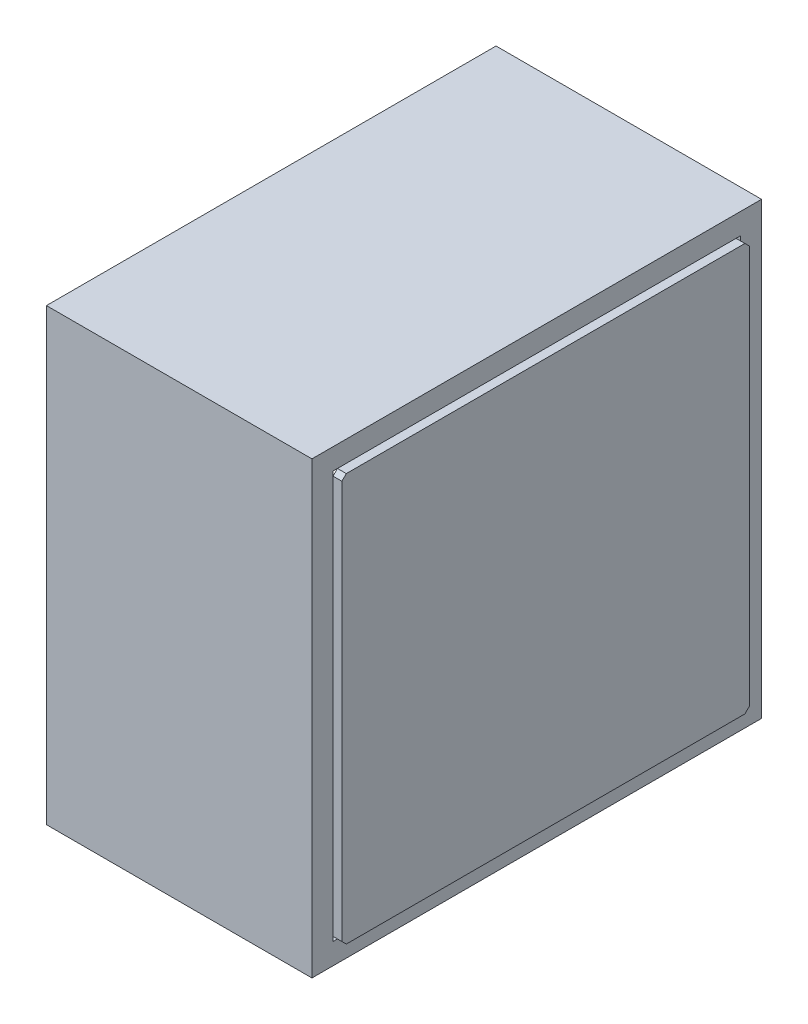
ISO-10303-21;
HEADER;
FILE_DESCRIPTION(('STEP AP214'),'2;1');
FILE_NAME('part.step','',(''),(''),'','','');
FILE_SCHEMA(('AUTOMOTIVE_DESIGN { 1 0 10303 214 1 1 1 1 }'));
ENDSEC;
DATA;
#1=APPLICATION_CONTEXT('core data for automotive mechanical design processes');
#2=APPLICATION_PROTOCOL_DEFINITION('international standard','automotive_design',2000,#1);
#3=PRODUCT_CONTEXT('',#1,'mechanical');
#4=PRODUCT('Part','Part','',(#3));
#5=PRODUCT_RELATED_PRODUCT_CATEGORY('part','',(#4));
#6=PRODUCT_DEFINITION_FORMATION('','',#4);
#7=PRODUCT_DEFINITION_CONTEXT('part definition',#1,'design');
#8=PRODUCT_DEFINITION('design','',#6,#7);
#9=PRODUCT_DEFINITION_SHAPE('','',#8);
#10=(LENGTH_UNIT() NAMED_UNIT(*) SI_UNIT(.MILLI.,.METRE.));
#11=(NAMED_UNIT(*) PLANE_ANGLE_UNIT() SI_UNIT($,.RADIAN.));
#12=(NAMED_UNIT(*) SI_UNIT($,.STERADIAN.) SOLID_ANGLE_UNIT());
#13=UNCERTAINTY_MEASURE_WITH_UNIT(LENGTH_MEASURE(1.E-05),#10,'distance_accuracy_value','');
#14=(GEOMETRIC_REPRESENTATION_CONTEXT(3) GLOBAL_UNCERTAINTY_ASSIGNED_CONTEXT((#13)) GLOBAL_UNIT_ASSIGNED_CONTEXT((#10,
#11,#12)) REPRESENTATION_CONTEXT('',''));
#15=CARTESIAN_POINT('',(0.,0.,0.));
#16=DIRECTION('',(0.,0.,1.));
#17=DIRECTION('',(1.,0.,0.));
#18=AXIS2_PLACEMENT_3D('',#15,#16,#17);
#19=CARTESIAN_POINT('',(62.,45.0375,-46.0375));
#20=DIRECTION('',(0.,-0.707106781186547,0.707106781186547));
#21=DIRECTION('',(0.,-0.707106781186548,-0.707106781186548));
#22=AXIS2_PLACEMENT_3D('',#19,#20,#21);
#23=PLANE('',#22);
#24=DIRECTION('',(0.,0.707106781186547,0.707106781186547));
#25=VECTOR('',#24,1.);
#26=CARTESIAN_POINT('',(60.,45.0375,-46.0375));
#27=LINE('',#26,#25);
#28=CARTESIAN_POINT('',(60.,45.0375,-46.0375));
#29=VERTEX_POINT('',#28);
#30=CARTESIAN_POINT('',(60.,46.0375,-45.0375));
#31=VERTEX_POINT('',#30);
#32=EDGE_CURVE('E164',#29,#31,#27,.T.);
#33=ORIENTED_EDGE('',*,*,#32,.T.);
#34=DIRECTION('',(-1.,0.,0.));
#35=VECTOR('',#34,1.);
#36=CARTESIAN_POINT('',(62.,46.0375,-45.0375));
#37=LINE('',#36,#35);
#38=CARTESIAN_POINT('',(62.,46.0375,-45.0375));
#39=VERTEX_POINT('',#38);
#40=EDGE_CURVE('E13',#39,#31,#37,.T.);
#41=ORIENTED_EDGE('',*,*,#40,.F.);
#42=DIRECTION('',(0.,0.707106781186547,0.707106781186547));
#43=VECTOR('',#42,1.);
#44=CARTESIAN_POINT('',(62.,45.0375,-46.0375));
#45=LINE('',#44,#43);
#46=CARTESIAN_POINT('',(62.,45.0375,-46.0375));
#47=VERTEX_POINT('',#46);
#48=EDGE_CURVE('E178',#47,#39,#45,.T.);
#49=ORIENTED_EDGE('',*,*,#48,.F.);
#50=DIRECTION('',(-1.,0.,0.));
#51=VECTOR('',#50,1.);
#52=CARTESIAN_POINT('',(62.,45.0375,-46.0375));
#53=LINE('',#52,#51);
#54=EDGE_CURVE('E161',#47,#29,#53,.T.);
#55=ORIENTED_EDGE('',*,*,#54,.T.);
#56=EDGE_LOOP('',(#33,#41,#49,#55));
#57=FACE_BOUND('',#56,.T.);
#58=ADVANCED_FACE('F68',(#57),#23,.F.);
#59=CARTESIAN_POINT('',(62.,46.0375,-45.0375));
#60=DIRECTION('',(0.,-1.,0.));
#61=DIRECTION('',(0.,0.,-1.));
#62=AXIS2_PLACEMENT_3D('',#59,#60,#61);
#63=PLANE('',#62);
#64=DIRECTION('',(0.,0.,1.));
#65=VECTOR('',#64,1.);
#66=CARTESIAN_POINT('',(60.,46.0375,-45.0375));
#67=LINE('',#66,#65);
#68=CARTESIAN_POINT('',(60.,46.0375,45.0375));
#69=VERTEX_POINT('',#68);
#70=EDGE_CURVE('E169',#31,#69,#67,.T.);
#71=ORIENTED_EDGE('',*,*,#70,.T.);
#72=DIRECTION('',(-1.,0.,0.));
#73=VECTOR('',#72,1.);
#74=CARTESIAN_POINT('',(62.,46.0375,45.0375));
#75=LINE('',#74,#73);
#76=CARTESIAN_POINT('',(62.,46.0375,45.0375));
#77=VERTEX_POINT('',#76);
#78=EDGE_CURVE('E77',#77,#69,#75,.T.);
#79=ORIENTED_EDGE('',*,*,#78,.F.);
#80=DIRECTION('',(0.,0.,1.));
#81=VECTOR('',#80,1.);
#82=CARTESIAN_POINT('',(62.,46.0375,-45.0375));
#83=LINE('',#82,#81);
#84=EDGE_CURVE('E126',#39,#77,#83,.T.);
#85=ORIENTED_EDGE('',*,*,#84,.F.);
#86=ORIENTED_EDGE('',*,*,#40,.T.);
#87=EDGE_LOOP('',(#71,#79,#85,#86));
#88=FACE_BOUND('',#87,.T.);
#89=ADVANCED_FACE('F212',(#88),#63,.F.);
#90=CARTESIAN_POINT('',(62.,46.0375,45.0375));
#91=DIRECTION('',(0.,-0.707106781186547,-0.707106781186547));
#92=DIRECTION('',(0.,0.707106781186548,-0.707106781186548));
#93=AXIS2_PLACEMENT_3D('',#90,#91,#92);
#94=PLANE('',#93);
#95=DIRECTION('',(0.,-0.707106781186547,0.707106781186547));
#96=VECTOR('',#95,1.);
#97=CARTESIAN_POINT('',(60.,46.0375,45.0375));
#98=LINE('',#97,#96);
#99=CARTESIAN_POINT('',(60.,45.0375,46.0375));
#100=VERTEX_POINT('',#99);
#101=EDGE_CURVE('E168',#69,#100,#98,.T.);
#102=ORIENTED_EDGE('',*,*,#101,.T.);
#103=DIRECTION('',(-1.,0.,0.));
#104=VECTOR('',#103,1.);
#105=CARTESIAN_POINT('',(62.,45.0375,46.0375));
#106=LINE('',#105,#104);
#107=CARTESIAN_POINT('',(62.,45.0375,46.0375));
#108=VERTEX_POINT('',#107);
#109=EDGE_CURVE('E186',#108,#100,#106,.T.);
#110=ORIENTED_EDGE('',*,*,#109,.F.);
#111=DIRECTION('',(0.,-0.707106781186547,0.707106781186547));
#112=VECTOR('',#111,1.);
#113=CARTESIAN_POINT('',(62.,46.0375,45.0375));
#114=LINE('',#113,#112);
#115=EDGE_CURVE('E193',#77,#108,#114,.T.);
#116=ORIENTED_EDGE('',*,*,#115,.F.);
#117=ORIENTED_EDGE('',*,*,#78,.T.);
#118=EDGE_LOOP('',(#102,#110,#116,#117));
#119=FACE_BOUND('',#118,.T.);
#120=ADVANCED_FACE('F191',(#119),#94,.F.);
#121=CARTESIAN_POINT('',(62.,45.0375,46.0375));
#122=DIRECTION('',(0.,0.,-1.));
#123=DIRECTION('',(-1.,0.,0.));
#124=AXIS2_PLACEMENT_3D('',#121,#122,#123);
#125=PLANE('',#124);
#126=DIRECTION('',(0.,-1.,0.));
#127=VECTOR('',#126,1.);
#128=CARTESIAN_POINT('',(60.,45.0375,46.0375));
#129=LINE('',#128,#127);
#130=CARTESIAN_POINT('',(60.,-45.0375,46.0375));
#131=VERTEX_POINT('',#130);
#132=EDGE_CURVE('E172',#100,#131,#129,.T.);
#133=ORIENTED_EDGE('',*,*,#132,.T.);
#134=DIRECTION('',(-1.,0.,0.));
#135=VECTOR('',#134,1.);
#136=CARTESIAN_POINT('',(62.,-45.0375,46.0375));
#137=LINE('',#136,#135);
#138=CARTESIAN_POINT('',(62.,-45.0375,46.0375));
#139=VERTEX_POINT('',#138);
#140=EDGE_CURVE('E181',#139,#131,#137,.T.);
#141=ORIENTED_EDGE('',*,*,#140,.F.);
#142=DIRECTION('',(0.,-1.,0.));
#143=VECTOR('',#142,1.);
#144=CARTESIAN_POINT('',(62.,45.0375,46.0375));
#145=LINE('',#144,#143);
#146=EDGE_CURVE('E206',#108,#139,#145,.T.);
#147=ORIENTED_EDGE('',*,*,#146,.F.);
#148=ORIENTED_EDGE('',*,*,#109,.T.);
#149=EDGE_LOOP('',(#133,#141,#147,#148));
#150=FACE_BOUND('',#149,.T.);
#151=ADVANCED_FACE('F205',(#150),#125,.F.);
#152=CARTESIAN_POINT('',(62.,-45.0375,46.0375));
#153=DIRECTION('',(0.,0.707106781186547,-0.707106781186547));
#154=DIRECTION('',(0.,0.707106781186548,0.707106781186548));
#155=AXIS2_PLACEMENT_3D('',#152,#153,#154);
#156=PLANE('',#155);
#157=DIRECTION('',(0.,-0.707106781186547,-0.707106781186547));
#158=VECTOR('',#157,1.);
#159=CARTESIAN_POINT('',(60.,-45.0375,46.0375));
#160=LINE('',#159,#158);
#161=CARTESIAN_POINT('',(60.,-46.0375,45.0375));
#162=VERTEX_POINT('',#161);
#163=EDGE_CURVE('E173',#131,#162,#160,.T.);
#164=ORIENTED_EDGE('',*,*,#163,.T.);
#165=DIRECTION('',(-1.,0.,0.));
#166=VECTOR('',#165,1.);
#167=CARTESIAN_POINT('',(62.,-46.0375,45.0375));
#168=LINE('',#167,#166);
#169=CARTESIAN_POINT('',(62.,-46.0375,45.0375));
#170=VERTEX_POINT('',#169);
#171=EDGE_CURVE('E156',#170,#162,#168,.T.);
#172=ORIENTED_EDGE('',*,*,#171,.F.);
#173=DIRECTION('',(0.,-0.707106781186547,-0.707106781186547));
#174=VECTOR('',#173,1.);
#175=CARTESIAN_POINT('',(62.,-45.0375,46.0375));
#176=LINE('',#175,#174);
#177=EDGE_CURVE('E150',#139,#170,#176,.T.);
#178=ORIENTED_EDGE('',*,*,#177,.F.);
#179=ORIENTED_EDGE('',*,*,#140,.T.);
#180=EDGE_LOOP('',(#164,#172,#178,#179));
#181=FACE_BOUND('',#180,.T.);
#182=ADVANCED_FACE('F202',(#181),#156,.F.);
#183=CARTESIAN_POINT('',(62.,-46.0375,45.0375));
#184=DIRECTION('',(0.,1.,0.));
#185=DIRECTION('',(0.,0.,1.));
#186=AXIS2_PLACEMENT_3D('',#183,#184,#185);
#187=PLANE('',#186);
#188=DIRECTION('',(0.,0.,-1.));
#189=VECTOR('',#188,1.);
#190=CARTESIAN_POINT('',(60.,-46.0375,45.0375));
#191=LINE('',#190,#189);
#192=CARTESIAN_POINT('',(60.,-46.0375,-45.0375));
#193=VERTEX_POINT('',#192);
#194=EDGE_CURVE('E154',#162,#193,#191,.T.);
#195=ORIENTED_EDGE('',*,*,#194,.T.);
#196=DIRECTION('',(-1.,0.,0.));
#197=VECTOR('',#196,1.);
#198=CARTESIAN_POINT('',(62.,-46.0375,-45.0375));
#199=LINE('',#198,#197);
#200=CARTESIAN_POINT('',(62.,-46.0375,-45.0375));
#201=VERTEX_POINT('',#200);
#202=EDGE_CURVE('E155',#201,#193,#199,.T.);
#203=ORIENTED_EDGE('',*,*,#202,.F.);
#204=DIRECTION('',(0.,0.,-1.));
#205=VECTOR('',#204,1.);
#206=CARTESIAN_POINT('',(62.,-46.0375,45.0375));
#207=LINE('',#206,#205);
#208=EDGE_CURVE('E143',#170,#201,#207,.T.);
#209=ORIENTED_EDGE('',*,*,#208,.F.);
#210=ORIENTED_EDGE('',*,*,#171,.T.);
#211=EDGE_LOOP('',(#195,#203,#209,#210));
#212=FACE_BOUND('',#211,.T.);
#213=ADVANCED_FACE('F153',(#212),#187,.F.);
#214=CARTESIAN_POINT('',(62.,-46.0375,-45.0375));
#215=DIRECTION('',(0.,0.707106781186547,0.707106781186547));
#216=DIRECTION('',(0.,-0.707106781186548,0.707106781186548));
#217=AXIS2_PLACEMENT_3D('',#214,#215,#216);
#218=PLANE('',#217);
#219=DIRECTION('',(0.,0.707106781186547,-0.707106781186547));
#220=VECTOR('',#219,1.);
#221=CARTESIAN_POINT('',(60.,-46.0375,-45.0375));
#222=LINE('',#221,#220);
#223=CARTESIAN_POINT('',(60.,-45.0375,-46.0375));
#224=VERTEX_POINT('',#223);
#225=EDGE_CURVE('E111',#193,#224,#222,.T.);
#226=ORIENTED_EDGE('',*,*,#225,.T.);
#227=DIRECTION('',(-1.,0.,0.));
#228=VECTOR('',#227,1.);
#229=CARTESIAN_POINT('',(62.,-45.0375,-46.0375));
#230=LINE('',#229,#228);
#231=CARTESIAN_POINT('',(62.,-45.0375,-46.0375));
#232=VERTEX_POINT('',#231);
#233=EDGE_CURVE('E160',#232,#224,#230,.T.);
#234=ORIENTED_EDGE('',*,*,#233,.F.);
#235=DIRECTION('',(0.,0.707106781186547,-0.707106781186547));
#236=VECTOR('',#235,1.);
#237=CARTESIAN_POINT('',(62.,-46.0375,-45.0375));
#238=LINE('',#237,#236);
#239=EDGE_CURVE('E144',#201,#232,#238,.T.);
#240=ORIENTED_EDGE('',*,*,#239,.F.);
#241=ORIENTED_EDGE('',*,*,#202,.T.);
#242=EDGE_LOOP('',(#226,#234,#240,#241));
#243=FACE_BOUND('',#242,.T.);
#244=ADVANCED_FACE('F157',(#243),#218,.F.);
#245=CARTESIAN_POINT('',(62.,-45.0375,-46.0375));
#246=DIRECTION('',(0.,0.,1.));
#247=DIRECTION('',(0.,-1.,0.));
#248=AXIS2_PLACEMENT_3D('',#245,#246,#247);
#249=PLANE('',#248);
#250=DIRECTION('',(0.,1.,0.));
#251=VECTOR('',#250,1.);
#252=CARTESIAN_POINT('',(60.,-45.0375,-46.0375));
#253=LINE('',#252,#251);
#254=EDGE_CURVE('E120',#224,#29,#253,.T.);
#255=ORIENTED_EDGE('',*,*,#254,.T.);
#256=ORIENTED_EDGE('',*,*,#54,.F.);
#257=DIRECTION('',(0.,1.,0.));
#258=VECTOR('',#257,1.);
#259=CARTESIAN_POINT('',(62.,-45.0375,-46.0375));
#260=LINE('',#259,#258);
#261=EDGE_CURVE('E82',#232,#47,#260,.T.);
#262=ORIENTED_EDGE('',*,*,#261,.F.);
#263=ORIENTED_EDGE('',*,*,#233,.T.);
#264=EDGE_LOOP('',(#255,#256,#262,#263));
#265=FACE_BOUND('',#264,.T.);
#266=ADVANCED_FACE('F230',(#265),#249,.F.);
#267=CARTESIAN_POINT('',(62.,0.,0.));
#268=DIRECTION('',(1.,0.,0.));
#269=DIRECTION('',(0.,0.,-1.));
#270=AXIS2_PLACEMENT_3D('',#267,#268,#269);
#271=PLANE('',#270);
#272=ORIENTED_EDGE('',*,*,#48,.T.);
#273=ORIENTED_EDGE('',*,*,#84,.T.);
#274=ORIENTED_EDGE('',*,*,#115,.T.);
#275=ORIENTED_EDGE('',*,*,#146,.T.);
#276=ORIENTED_EDGE('',*,*,#177,.T.);
#277=ORIENTED_EDGE('',*,*,#208,.T.);
#278=ORIENTED_EDGE('',*,*,#239,.T.);
#279=ORIENTED_EDGE('',*,*,#261,.T.);
#280=EDGE_LOOP('',(#272,#273,#274,#275,#276,#277,#278,#279));
#281=FACE_BOUND('',#280,.T.);
#282=ADVANCED_FACE('F141',(#281),#271,.T.);
#283=CARTESIAN_POINT('',(60.,0.,0.));
#284=DIRECTION('',(1.,0.,0.));
#285=DIRECTION('',(0.,0.,-1.));
#286=AXIS2_PLACEMENT_3D('',#283,#284,#285);
#287=PLANE('',#286);
#288=ORIENTED_EDGE('',*,*,#32,.F.);
#289=ORIENTED_EDGE('',*,*,#254,.F.);
#290=ORIENTED_EDGE('',*,*,#225,.F.);
#291=ORIENTED_EDGE('',*,*,#194,.F.);
#292=ORIENTED_EDGE('',*,*,#163,.F.);
#293=ORIENTED_EDGE('',*,*,#132,.F.);
#294=ORIENTED_EDGE('',*,*,#101,.F.);
#295=ORIENTED_EDGE('',*,*,#70,.F.);
#296=EDGE_LOOP('',(#288,#289,#290,#291,#292,#293,#294,#295));
#297=FACE_BOUND('',#296,.T.);
#298=ADVANCED_FACE('F196',(#297),#287,.F.);
#299=CLOSED_SHELL('',(#58,#89,#120,#151,#182,#213,#244,#266,#282,#298));
#300=MANIFOLD_SOLID_BREP('B2',#299);
#301=CARTESIAN_POINT('',(60.,50.8,50.8));
#302=DIRECTION('',(0.,-1.,0.));
#303=DIRECTION('',(0.,0.,-1.));
#304=AXIS2_PLACEMENT_3D('',#301,#302,#303);
#305=PLANE('',#304);
#306=DIRECTION('',(0.,0.,1.));
#307=VECTOR('',#306,1.);
#308=CARTESIAN_POINT('',(0.,50.8,50.8));
#309=LINE('',#308,#307);
#310=CARTESIAN_POINT('',(0.,50.8,-50.8));
#311=VERTEX_POINT('',#310);
#312=CARTESIAN_POINT('',(0.,50.8,50.8));
#313=VERTEX_POINT('',#312);
#314=EDGE_CURVE('E404',#311,#313,#309,.T.);
#315=ORIENTED_EDGE('',*,*,#314,.T.);
#316=DIRECTION('',(-1.,0.,0.));
#317=VECTOR('',#316,1.);
#318=CARTESIAN_POINT('',(60.,50.8,50.8));
#319=LINE('',#318,#317);
#320=CARTESIAN_POINT('',(60.,50.8,50.8));
#321=VERTEX_POINT('',#320);
#322=EDGE_CURVE('E66',#321,#313,#319,.T.);
#323=ORIENTED_EDGE('',*,*,#322,.F.);
#324=DIRECTION('',(0.,0.,1.));
#325=VECTOR('',#324,1.);
#326=CARTESIAN_POINT('',(60.,50.8,50.8));
#327=LINE('',#326,#325);
#328=CARTESIAN_POINT('',(60.,50.8,-50.8));
#329=VERTEX_POINT('',#328);
#330=EDGE_CURVE('E378',#329,#321,#327,.T.);
#331=ORIENTED_EDGE('',*,*,#330,.F.);
#332=DIRECTION('',(-1.,0.,0.));
#333=VECTOR('',#332,1.);
#334=CARTESIAN_POINT('',(60.,50.8,-50.8));
#335=LINE('',#334,#333);
#336=EDGE_CURVE('E414',#329,#311,#335,.T.);
#337=ORIENTED_EDGE('',*,*,#336,.T.);
#338=EDGE_LOOP('',(#315,#323,#331,#337));
#339=FACE_BOUND('',#338,.T.);
#340=ADVANCED_FACE('F297',(#339),#305,.F.);
#341=CARTESIAN_POINT('',(60.,50.8,50.8));
#342=DIRECTION('',(0.,0.,-1.));
#343=DIRECTION('',(-1.,0.,0.));
#344=AXIS2_PLACEMENT_3D('',#341,#342,#343);
#345=PLANE('',#344);
#346=DIRECTION('',(0.,-1.,0.));
#347=VECTOR('',#346,1.);
#348=CARTESIAN_POINT('',(0.,50.8,50.8));
#349=LINE('',#348,#347);
#350=CARTESIAN_POINT('',(0.,-50.8,50.8));
#351=VERTEX_POINT('',#350);
#352=EDGE_CURVE('E382',#313,#351,#349,.T.);
#353=ORIENTED_EDGE('',*,*,#352,.T.);
#354=DIRECTION('',(-1.,0.,0.));
#355=VECTOR('',#354,1.);
#356=CARTESIAN_POINT('',(60.,-50.8,50.8));
#357=LINE('',#356,#355);
#358=CARTESIAN_POINT('',(60.,-50.8,50.8));
#359=VERTEX_POINT('',#358);
#360=EDGE_CURVE('E307',#359,#351,#357,.T.);
#361=ORIENTED_EDGE('',*,*,#360,.F.);
#362=DIRECTION('',(0.,-1.,0.));
#363=VECTOR('',#362,1.);
#364=CARTESIAN_POINT('',(60.,50.8,50.8));
#365=LINE('',#364,#363);
#366=EDGE_CURVE('E375',#321,#359,#365,.T.);
#367=ORIENTED_EDGE('',*,*,#366,.F.);
#368=ORIENTED_EDGE('',*,*,#322,.T.);
#369=EDGE_LOOP('',(#353,#361,#367,#368));
#370=FACE_BOUND('',#369,.T.);
#371=ADVANCED_FACE('F385',(#370),#345,.F.);
#372=CARTESIAN_POINT('',(60.,-50.8,-50.8));
#373=DIRECTION('',(0.,1.,0.));
#374=DIRECTION('',(0.,0.,1.));
#375=AXIS2_PLACEMENT_3D('',#372,#373,#374);
#376=PLANE('',#375);
#377=DIRECTION('',(0.,0.,-1.));
#378=VECTOR('',#377,1.);
#379=CARTESIAN_POINT('',(0.,-50.8,-50.8));
#380=LINE('',#379,#378);
#381=CARTESIAN_POINT('',(0.,-50.8,-50.8));
#382=VERTEX_POINT('',#381);
#383=EDGE_CURVE('E342',#351,#382,#380,.T.);
#384=ORIENTED_EDGE('',*,*,#383,.T.);
#385=DIRECTION('',(-1.,0.,0.));
#386=VECTOR('',#385,1.);
#387=CARTESIAN_POINT('',(60.,-50.8,-50.8));
#388=LINE('',#387,#386);
#389=CARTESIAN_POINT('',(60.,-50.8,-50.8));
#390=VERTEX_POINT('',#389);
#391=EDGE_CURVE('E383',#390,#382,#388,.T.);
#392=ORIENTED_EDGE('',*,*,#391,.F.);
#393=DIRECTION('',(0.,0.,-1.));
#394=VECTOR('',#393,1.);
#395=CARTESIAN_POINT('',(60.,-50.8,-50.8));
#396=LINE('',#395,#394);
#397=EDGE_CURVE('E376',#359,#390,#396,.T.);
#398=ORIENTED_EDGE('',*,*,#397,.F.);
#399=ORIENTED_EDGE('',*,*,#360,.T.);
#400=EDGE_LOOP('',(#384,#392,#398,#399));
#401=FACE_BOUND('',#400,.T.);
#402=ADVANCED_FACE('F387',(#401),#376,.F.);
#403=CARTESIAN_POINT('',(60.,46.0375,46.0375));
#404=DIRECTION('',(0.,0.,-1.));
#405=DIRECTION('',(-1.,0.,0.));
#406=AXIS2_PLACEMENT_3D('',#403,#404,#405);
#407=PLANE('',#406);
#408=DIRECTION('',(0.,-1.,0.));
#409=VECTOR('',#408,1.);
#410=CARTESIAN_POINT('',(0.,46.0375,46.0375));
#411=LINE('',#410,#409);
#412=CARTESIAN_POINT('',(0.,46.0375,46.0375));
#413=VERTEX_POINT('',#412);
#414=CARTESIAN_POINT('',(0.,-46.0375,46.0375));
#415=VERTEX_POINT('',#414);
#416=EDGE_CURVE('E392',#413,#415,#411,.T.);
#417=ORIENTED_EDGE('',*,*,#416,.F.);
#418=DIRECTION('',(-1.,0.,0.));
#419=VECTOR('',#418,1.);
#420=CARTESIAN_POINT('',(60.,46.0375,46.0375));
#421=LINE('',#420,#419);
#422=CARTESIAN_POINT('',(60.,46.0375,46.0375));
#423=VERTEX_POINT('',#422);
#424=EDGE_CURVE('E304',#423,#413,#421,.T.);
#425=ORIENTED_EDGE('',*,*,#424,.F.);
#426=DIRECTION('',(0.,-1.,0.));
#427=VECTOR('',#426,1.);
#428=CARTESIAN_POINT('',(60.,46.0375,46.0375));
#429=LINE('',#428,#427);
#430=CARTESIAN_POINT('',(60.,-46.0375,46.0375));
#431=VERTEX_POINT('',#430);
#432=EDGE_CURVE('E410',#423,#431,#429,.T.);
#433=ORIENTED_EDGE('',*,*,#432,.T.);
#434=DIRECTION('',(-1.,0.,0.));
#435=VECTOR('',#434,1.);
#436=CARTESIAN_POINT('',(60.,-46.0375,46.0375));
#437=LINE('',#436,#435);
#438=EDGE_CURVE('E389',#431,#415,#437,.T.);
#439=ORIENTED_EDGE('',*,*,#438,.T.);
#440=EDGE_LOOP('',(#417,#425,#433,#439));
#441=FACE_BOUND('',#440,.T.);
#442=ADVANCED_FACE('F298',(#441),#407,.T.);
#443=CARTESIAN_POINT('',(60.,46.0375,46.0375));
#444=DIRECTION('',(0.,-1.,0.));
#445=DIRECTION('',(0.,0.,-1.));
#446=AXIS2_PLACEMENT_3D('',#443,#444,#445);
#447=PLANE('',#446);
#448=DIRECTION('',(0.,0.,1.));
#449=VECTOR('',#448,1.);
#450=CARTESIAN_POINT('',(0.,46.0375,46.0375));
#451=LINE('',#450,#449);
#452=CARTESIAN_POINT('',(0.,46.0375,-46.0375));
#453=VERTEX_POINT('',#452);
#454=EDGE_CURVE('E395',#453,#413,#451,.T.);
#455=ORIENTED_EDGE('',*,*,#454,.F.);
#456=DIRECTION('',(-1.,0.,0.));
#457=VECTOR('',#456,1.);
#458=CARTESIAN_POINT('',(60.,46.0375,-46.0375));
#459=LINE('',#458,#457);
#460=CARTESIAN_POINT('',(60.,46.0375,-46.0375));
#461=VERTEX_POINT('',#460);
#462=EDGE_CURVE('E418',#461,#453,#459,.T.);
#463=ORIENTED_EDGE('',*,*,#462,.F.);
#464=DIRECTION('',(0.,0.,1.));
#465=VECTOR('',#464,1.);
#466=CARTESIAN_POINT('',(60.,46.0375,46.0375));
#467=LINE('',#466,#465);
#468=EDGE_CURVE('E422',#461,#423,#467,.T.);
#469=ORIENTED_EDGE('',*,*,#468,.T.);
#470=ORIENTED_EDGE('',*,*,#424,.T.);
#471=EDGE_LOOP('',(#455,#463,#469,#470));
#472=FACE_BOUND('',#471,.T.);
#473=ADVANCED_FACE('F421',(#472),#447,.T.);
#474=CARTESIAN_POINT('',(60.,-46.0375,-46.0375));
#475=DIRECTION('',(0.,0.,1.));
#476=DIRECTION('',(1.,0.,0.));
#477=AXIS2_PLACEMENT_3D('',#474,#475,#476);
#478=PLANE('',#477);
#479=DIRECTION('',(0.,1.,0.));
#480=VECTOR('',#479,1.);
#481=CARTESIAN_POINT('',(0.,-46.0375,-46.0375));
#482=LINE('',#481,#480);
#483=CARTESIAN_POINT('',(0.,-46.0375,-46.0375));
#484=VERTEX_POINT('',#483);
#485=EDGE_CURVE('E400',#484,#453,#482,.T.);
#486=ORIENTED_EDGE('',*,*,#485,.F.);
#487=DIRECTION('',(-1.,0.,0.));
#488=VECTOR('',#487,1.);
#489=CARTESIAN_POINT('',(60.,-46.0375,-46.0375));
#490=LINE('',#489,#488);
#491=CARTESIAN_POINT('',(60.,-46.0375,-46.0375));
#492=VERTEX_POINT('',#491);
#493=EDGE_CURVE('E412',#492,#484,#490,.T.);
#494=ORIENTED_EDGE('',*,*,#493,.F.);
#495=DIRECTION('',(0.,1.,0.));
#496=VECTOR('',#495,1.);
#497=CARTESIAN_POINT('',(60.,-46.0375,-46.0375));
#498=LINE('',#497,#496);
#499=EDGE_CURVE('E435',#492,#461,#498,.T.);
#500=ORIENTED_EDGE('',*,*,#499,.T.);
#501=ORIENTED_EDGE('',*,*,#462,.T.);
#502=EDGE_LOOP('',(#486,#494,#500,#501));
#503=FACE_BOUND('',#502,.T.);
#504=ADVANCED_FACE('F429',(#503),#478,.T.);
#505=CARTESIAN_POINT('',(60.,-46.0375,-46.0375));
#506=DIRECTION('',(0.,1.,0.));
#507=DIRECTION('',(0.,0.,1.));
#508=AXIS2_PLACEMENT_3D('',#505,#506,#507);
#509=PLANE('',#508);
#510=DIRECTION('',(0.,0.,-1.));
#511=VECTOR('',#510,1.);
#512=CARTESIAN_POINT('',(0.,-46.0375,-46.0375));
#513=LINE('',#512,#511);
#514=EDGE_CURVE('E402',#415,#484,#513,.T.);
#515=ORIENTED_EDGE('',*,*,#514,.F.);
#516=ORIENTED_EDGE('',*,*,#438,.F.);
#517=DIRECTION('',(0.,0.,-1.));
#518=VECTOR('',#517,1.);
#519=CARTESIAN_POINT('',(60.,-46.0375,-46.0375));
#520=LINE('',#519,#518);
#521=EDGE_CURVE('E440',#431,#492,#520,.T.);
#522=ORIENTED_EDGE('',*,*,#521,.T.);
#523=ORIENTED_EDGE('',*,*,#493,.T.);
#524=EDGE_LOOP('',(#515,#516,#522,#523));
#525=FACE_BOUND('',#524,.T.);
#526=ADVANCED_FACE('F438',(#525),#509,.T.);
#527=CARTESIAN_POINT('',(60.,-50.8,-50.8));
#528=DIRECTION('',(0.,0.,1.));
#529=DIRECTION('',(0.,-1.,0.));
#530=AXIS2_PLACEMENT_3D('',#527,#528,#529);
#531=PLANE('',#530);
#532=DIRECTION('',(0.,1.,0.));
#533=VECTOR('',#532,1.);
#534=CARTESIAN_POINT('',(0.,-50.8,-50.8));
#535=LINE('',#534,#533);
#536=EDGE_CURVE('E351',#382,#311,#535,.T.);
#537=ORIENTED_EDGE('',*,*,#536,.T.);
#538=ORIENTED_EDGE('',*,*,#336,.F.);
#539=DIRECTION('',(0.,1.,0.));
#540=VECTOR('',#539,1.);
#541=CARTESIAN_POINT('',(60.,-50.8,-50.8));
#542=LINE('',#541,#540);
#543=EDGE_CURVE('E316',#390,#329,#542,.T.);
#544=ORIENTED_EDGE('',*,*,#543,.F.);
#545=ORIENTED_EDGE('',*,*,#391,.T.);
#546=EDGE_LOOP('',(#537,#538,#544,#545));
#547=FACE_BOUND('',#546,.T.);
#548=ADVANCED_FACE('F441',(#547),#531,.F.);
#549=CARTESIAN_POINT('',(60.,0.,0.));
#550=DIRECTION('',(1.,0.,0.));
#551=DIRECTION('',(0.,0.,-1.));
#552=AXIS2_PLACEMENT_3D('',#549,#550,#551);
#553=PLANE('',#552);
#554=ORIENTED_EDGE('',*,*,#432,.F.);
#555=ORIENTED_EDGE('',*,*,#468,.F.);
#556=ORIENTED_EDGE('',*,*,#499,.F.);
#557=ORIENTED_EDGE('',*,*,#521,.F.);
#558=EDGE_LOOP('',(#554,#555,#556,#557));
#559=FACE_BOUND('',#558,.T.);
#560=ORIENTED_EDGE('',*,*,#330,.T.);
#561=ORIENTED_EDGE('',*,*,#366,.T.);
#562=ORIENTED_EDGE('',*,*,#397,.T.);
#563=ORIENTED_EDGE('',*,*,#543,.T.);
#564=EDGE_LOOP('',(#560,#561,#562,#563));
#565=FACE_BOUND('',#564,.T.);
#566=ADVANCED_FACE('F372',(#559,#565),#553,.T.);
#567=CARTESIAN_POINT('',(0.,0.,0.));
#568=DIRECTION('',(1.,0.,0.));
#569=DIRECTION('',(0.,0.,-1.));
#570=AXIS2_PLACEMENT_3D('',#567,#568,#569);
#571=PLANE('',#570);
#572=ORIENTED_EDGE('',*,*,#416,.T.);
#573=ORIENTED_EDGE('',*,*,#514,.T.);
#574=ORIENTED_EDGE('',*,*,#485,.T.);
#575=ORIENTED_EDGE('',*,*,#454,.T.);
#576=EDGE_LOOP('',(#572,#573,#574,#575));
#577=FACE_BOUND('',#576,.T.);
#578=ORIENTED_EDGE('',*,*,#314,.F.);
#579=ORIENTED_EDGE('',*,*,#536,.F.);
#580=ORIENTED_EDGE('',*,*,#383,.F.);
#581=ORIENTED_EDGE('',*,*,#352,.F.);
#582=EDGE_LOOP('',(#578,#579,#580,#581));
#583=FACE_BOUND('',#582,.T.);
#584=ADVANCED_FACE('F428',(#577,#583),#571,.F.);
#585=CLOSED_SHELL('',(#340,#371,#402,#442,#473,#504,#526,#548,#566,#584));
#586=MANIFOLD_SOLID_BREP('B7',#585);
#587=ADVANCED_BREP_SHAPE_REPRESENTATION('',(#18,#300,#586),#14);
#588=SHAPE_DEFINITION_REPRESENTATION(#9,#587);
ENDSEC;
END-ISO-10303-21;
